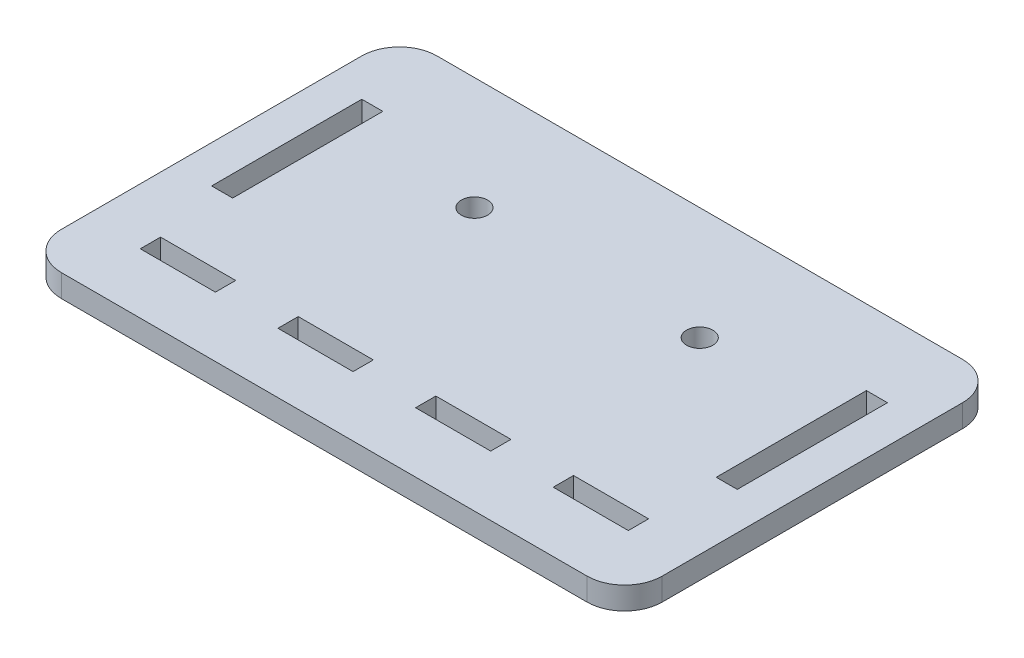
ISO-10303-21;
HEADER;
FILE_DESCRIPTION(('STEP AP214'),'2;1');
FILE_NAME('part.step','',(''),(''),'','','');
FILE_SCHEMA(('AUTOMOTIVE_DESIGN { 1 0 10303 214 1 1 1 1 }'));
ENDSEC;
DATA;
#1=APPLICATION_CONTEXT('core data for automotive mechanical design processes');
#2=APPLICATION_PROTOCOL_DEFINITION('international standard','automotive_design',2000,#1);
#3=PRODUCT_CONTEXT('',#1,'mechanical');
#4=PRODUCT('Part','Part','',(#3));
#5=PRODUCT_RELATED_PRODUCT_CATEGORY('part','',(#4));
#6=PRODUCT_DEFINITION_FORMATION('','',#4);
#7=PRODUCT_DEFINITION_CONTEXT('part definition',#1,'design');
#8=PRODUCT_DEFINITION('design','',#6,#7);
#9=PRODUCT_DEFINITION_SHAPE('','',#8);
#10=(LENGTH_UNIT() NAMED_UNIT(*) SI_UNIT(.MILLI.,.METRE.));
#11=(NAMED_UNIT(*) PLANE_ANGLE_UNIT() SI_UNIT($,.RADIAN.));
#12=(NAMED_UNIT(*) SI_UNIT($,.STERADIAN.) SOLID_ANGLE_UNIT());
#13=UNCERTAINTY_MEASURE_WITH_UNIT(LENGTH_MEASURE(1.E-05),#10,'distance_accuracy_value','');
#14=(GEOMETRIC_REPRESENTATION_CONTEXT(3) GLOBAL_UNCERTAINTY_ASSIGNED_CONTEXT((#13)) GLOBAL_UNIT_ASSIGNED_CONTEXT((#10,
#11,#12)) REPRESENTATION_CONTEXT('',''));
#15=CARTESIAN_POINT('',(0.,0.,0.));
#16=DIRECTION('',(0.,0.,1.));
#17=DIRECTION('',(1.,0.,0.));
#18=AXIS2_PLACEMENT_3D('',#15,#16,#17);
#19=CARTESIAN_POINT('',(0.,3.,0.));
#20=DIRECTION('',(0.,1.,0.));
#21=DIRECTION('',(0.,0.,1.));
#22=AXIS2_PLACEMENT_3D('',#19,#20,#21);
#23=PLANE('',#22);
#24=CARTESIAN_POINT('',(-15.,3.,-9.99999999999979));
#25=DIRECTION('',(0.,1.,0.));
#26=DIRECTION('',(0.,0.,1.));
#27=AXIS2_PLACEMENT_3D('',#24,#25,#26);
#28=CIRCLE('',#27,1.75);
#29=CARTESIAN_POINT('',(-15.,3.,-8.24999999999979));
#30=VERTEX_POINT('',#29);
#31=EDGE_CURVE('E928',#30,#30,#28,.T.);
#32=ORIENTED_EDGE('',*,*,#31,.F.);
#33=EDGE_LOOP('',(#32));
#34=FACE_BOUND('',#33,.T.);
#35=CARTESIAN_POINT('',(15.,3.,-10.));
#36=DIRECTION('',(0.,1.,0.));
#37=DIRECTION('',(0.,0.,1.));
#38=AXIS2_PLACEMENT_3D('',#35,#36,#37);
#39=CIRCLE('',#38,1.75);
#40=CARTESIAN_POINT('',(15.,3.,-8.25));
#41=VERTEX_POINT('',#40);
#42=EDGE_CURVE('E924',#41,#41,#39,.T.);
#43=ORIENTED_EDGE('',*,*,#42,.F.);
#44=EDGE_LOOP('',(#43));
#45=FACE_BOUND('',#44,.T.);
#46=DIRECTION('',(1.,0.,0.));
#47=VECTOR('',#46,1.);
#48=CARTESIAN_POINT('',(22.49,3.,17.));
#49=LINE('',#48,#47);
#50=CARTESIAN_POINT('',(22.49,3.,17.));
#51=VERTEX_POINT('',#50);
#52=CARTESIAN_POINT('',(32.49,3.,17.));
#53=VERTEX_POINT('',#52);
#54=EDGE_CURVE('E287',#51,#53,#49,.T.);
#55=ORIENTED_EDGE('',*,*,#54,.F.);
#56=DIRECTION('',(0.,0.,1.));
#57=VECTOR('',#56,1.);
#58=CARTESIAN_POINT('',(22.49,3.,17.));
#59=LINE('',#58,#57);
#60=CARTESIAN_POINT('',(22.49,3.,14.3));
#61=VERTEX_POINT('',#60);
#62=EDGE_CURVE('E285',#61,#51,#59,.T.);
#63=ORIENTED_EDGE('',*,*,#62,.F.);
#64=DIRECTION('',(-1.,0.,0.));
#65=VECTOR('',#64,1.);
#66=CARTESIAN_POINT('',(22.49,3.,14.3));
#67=LINE('',#66,#65);
#68=CARTESIAN_POINT('',(32.49,3.,14.3));
#69=VERTEX_POINT('',#68);
#70=EDGE_CURVE('E293',#69,#61,#67,.T.);
#71=ORIENTED_EDGE('',*,*,#70,.F.);
#72=DIRECTION('',(0.,0.,-1.));
#73=VECTOR('',#72,1.);
#74=CARTESIAN_POINT('',(32.49,3.,17.));
#75=LINE('',#74,#73);
#76=EDGE_CURVE('E290',#53,#69,#75,.T.);
#77=ORIENTED_EDGE('',*,*,#76,.F.);
#78=EDGE_LOOP('',(#55,#63,#71,#77));
#79=FACE_BOUND('',#78,.T.);
#80=DIRECTION('',(1.,0.,0.));
#81=VECTOR('',#80,1.);
#82=CARTESIAN_POINT('',(-14.17,3.,17.));
#83=LINE('',#82,#81);
#84=CARTESIAN_POINT('',(-14.17,3.,17.));
#85=VERTEX_POINT('',#84);
#86=CARTESIAN_POINT('',(-4.16999999999999,3.,17.));
#87=VERTEX_POINT('',#86);
#88=EDGE_CURVE('E349',#85,#87,#83,.T.);
#89=ORIENTED_EDGE('',*,*,#88,.F.);
#90=DIRECTION('',(0.,0.,1.));
#91=VECTOR('',#90,1.);
#92=CARTESIAN_POINT('',(-14.17,3.,17.));
#93=LINE('',#92,#91);
#94=CARTESIAN_POINT('',(-14.17,3.,14.3));
#95=VERTEX_POINT('',#94);
#96=EDGE_CURVE('E347',#95,#85,#93,.T.);
#97=ORIENTED_EDGE('',*,*,#96,.F.);
#98=DIRECTION('',(-1.,0.,0.));
#99=VECTOR('',#98,1.);
#100=CARTESIAN_POINT('',(-14.17,3.,14.3));
#101=LINE('',#100,#99);
#102=CARTESIAN_POINT('',(-4.16999999999999,3.,14.3));
#103=VERTEX_POINT('',#102);
#104=EDGE_CURVE('E355',#103,#95,#101,.T.);
#105=ORIENTED_EDGE('',*,*,#104,.F.);
#106=DIRECTION('',(0.,0.,-1.));
#107=VECTOR('',#106,1.);
#108=CARTESIAN_POINT('',(-4.16999999999999,3.,17.));
#109=LINE('',#108,#107);
#110=EDGE_CURVE('E352',#87,#103,#109,.T.);
#111=ORIENTED_EDGE('',*,*,#110,.F.);
#112=EDGE_LOOP('',(#89,#97,#105,#111));
#113=FACE_BOUND('',#112,.T.);
#114=DIRECTION('',(1.,0.,0.));
#115=VECTOR('',#114,1.);
#116=CARTESIAN_POINT('',(-32.5,3.,17.));
#117=LINE('',#116,#115);
#118=CARTESIAN_POINT('',(-32.5,3.,17.));
#119=VERTEX_POINT('',#118);
#120=CARTESIAN_POINT('',(-22.5,3.,17.));
#121=VERTEX_POINT('',#120);
#122=EDGE_CURVE('E411',#119,#121,#117,.T.);
#123=ORIENTED_EDGE('',*,*,#122,.F.);
#124=DIRECTION('',(0.,0.,1.));
#125=VECTOR('',#124,1.);
#126=CARTESIAN_POINT('',(-32.5,3.,17.));
#127=LINE('',#126,#125);
#128=CARTESIAN_POINT('',(-32.5,3.,14.3));
#129=VERTEX_POINT('',#128);
#130=EDGE_CURVE('E409',#129,#119,#127,.T.);
#131=ORIENTED_EDGE('',*,*,#130,.F.);
#132=DIRECTION('',(-1.,0.,0.));
#133=VECTOR('',#132,1.);
#134=CARTESIAN_POINT('',(-32.5,3.,14.3));
#135=LINE('',#134,#133);
#136=CARTESIAN_POINT('',(-22.5,3.,14.3));
#137=VERTEX_POINT('',#136);
#138=EDGE_CURVE('E417',#137,#129,#135,.T.);
#139=ORIENTED_EDGE('',*,*,#138,.F.);
#140=DIRECTION('',(0.,0.,-1.));
#141=VECTOR('',#140,1.);
#142=CARTESIAN_POINT('',(-22.5,3.,17.));
#143=LINE('',#142,#141);
#144=EDGE_CURVE('E414',#121,#137,#143,.T.);
#145=ORIENTED_EDGE('',*,*,#144,.F.);
#146=EDGE_LOOP('',(#123,#131,#139,#145));
#147=FACE_BOUND('',#146,.T.);
#148=DIRECTION('',(1.,0.,0.));
#149=VECTOR('',#148,1.);
#150=CARTESIAN_POINT('',(-40.,3.,25.));
#151=LINE('',#150,#149);
#152=CARTESIAN_POINT('',(-35.,3.,25.));
#153=VERTEX_POINT('',#152);
#154=CARTESIAN_POINT('',(35.,3.,25.));
#155=VERTEX_POINT('',#154);
#156=EDGE_CURVE('E443',#153,#155,#151,.T.);
#157=ORIENTED_EDGE('',*,*,#156,.T.);
#158=CARTESIAN_POINT('',(35.,3.,20.));
#159=DIRECTION('',(0.,1.,0.));
#160=DIRECTION('',(0.,0.,1.));
#161=AXIS2_PLACEMENT_3D('',#158,#159,#160);
#162=CIRCLE('',#161,5.);
#163=CARTESIAN_POINT('',(40.,3.,20.));
#164=VERTEX_POINT('',#163);
#165=EDGE_CURVE('E483',#155,#164,#162,.T.);
#166=ORIENTED_EDGE('',*,*,#165,.T.);
#167=DIRECTION('',(0.,0.,-1.));
#168=VECTOR('',#167,1.);
#169=CARTESIAN_POINT('',(40.,3.,-25.));
#170=LINE('',#169,#168);
#171=CARTESIAN_POINT('',(40.,3.,-20.));
#172=VERTEX_POINT('',#171);
#173=EDGE_CURVE('E447',#164,#172,#170,.T.);
#174=ORIENTED_EDGE('',*,*,#173,.T.);
#175=CARTESIAN_POINT('',(35.,3.,-20.));
#176=DIRECTION('',(0.,1.,0.));
#177=DIRECTION('',(0.,0.,1.));
#178=AXIS2_PLACEMENT_3D('',#175,#176,#177);
#179=CIRCLE('',#178,5.);
#180=CARTESIAN_POINT('',(35.,3.,-25.));
#181=VERTEX_POINT('',#180);
#182=EDGE_CURVE('E52',#172,#181,#179,.T.);
#183=ORIENTED_EDGE('',*,*,#182,.T.);
#184=DIRECTION('',(-1.,0.,0.));
#185=VECTOR('',#184,1.);
#186=CARTESIAN_POINT('',(40.,3.,-25.));
#187=LINE('',#186,#185);
#188=CARTESIAN_POINT('',(-35.,3.,-25.));
#189=VERTEX_POINT('',#188);
#190=EDGE_CURVE('E449',#181,#189,#187,.T.);
#191=ORIENTED_EDGE('',*,*,#190,.T.);
#192=CARTESIAN_POINT('',(-35.,3.,-20.));
#193=DIRECTION('',(0.,1.,0.));
#194=DIRECTION('',(0.,0.,1.));
#195=AXIS2_PLACEMENT_3D('',#192,#193,#194);
#196=CIRCLE('',#195,5.);
#197=CARTESIAN_POINT('',(-40.,3.,-20.));
#198=VERTEX_POINT('',#197);
#199=EDGE_CURVE('E479',#189,#198,#196,.T.);
#200=ORIENTED_EDGE('',*,*,#199,.T.);
#201=DIRECTION('',(0.,0.,1.));
#202=VECTOR('',#201,1.);
#203=CARTESIAN_POINT('',(-40.,3.,-25.));
#204=LINE('',#203,#202);
#205=CARTESIAN_POINT('',(-40.,3.,20.));
#206=VERTEX_POINT('',#205);
#207=EDGE_CURVE('E440',#198,#206,#204,.T.);
#208=ORIENTED_EDGE('',*,*,#207,.T.);
#209=CARTESIAN_POINT('',(-35.,3.,20.));
#210=DIRECTION('',(0.,1.,0.));
#211=DIRECTION('',(0.,0.,1.));
#212=AXIS2_PLACEMENT_3D('',#209,#210,#211);
#213=CIRCLE('',#212,5.);
#214=EDGE_CURVE('E481',#206,#153,#213,.T.);
#215=ORIENTED_EDGE('',*,*,#214,.T.);
#216=EDGE_LOOP('',(#157,#166,#174,#183,#191,#200,#208,#215));
#217=FACE_BOUND('',#216,.T.);
#218=DIRECTION('',(-1.,0.,0.));
#219=VECTOR('',#218,1.);
#220=CARTESIAN_POINT('',(35.,3.,-15.));
#221=LINE('',#220,#219);
#222=CARTESIAN_POINT('',(35.,3.,-15.));
#223=VERTEX_POINT('',#222);
#224=CARTESIAN_POINT('',(32.2,3.,-15.));
#225=VERTEX_POINT('',#224);
#226=EDGE_CURVE('E380',#223,#225,#221,.T.);
#227=ORIENTED_EDGE('',*,*,#226,.F.);
#228=DIRECTION('',(0.,0.,-1.));
#229=VECTOR('',#228,1.);
#230=CARTESIAN_POINT('',(35.,3.,-15.));
#231=LINE('',#230,#229);
#232=CARTESIAN_POINT('',(35.,3.,4.99999999999999));
#233=VERTEX_POINT('',#232);
#234=EDGE_CURVE('E378',#233,#223,#231,.T.);
#235=ORIENTED_EDGE('',*,*,#234,.F.);
#236=DIRECTION('',(1.,0.,0.));
#237=VECTOR('',#236,1.);
#238=CARTESIAN_POINT('',(35.,3.,4.99999999999999));
#239=LINE('',#238,#237);
#240=CARTESIAN_POINT('',(32.2,3.,4.99999999999999));
#241=VERTEX_POINT('',#240);
#242=EDGE_CURVE('E386',#241,#233,#239,.T.);
#243=ORIENTED_EDGE('',*,*,#242,.F.);
#244=DIRECTION('',(0.,0.,1.));
#245=VECTOR('',#244,1.);
#246=CARTESIAN_POINT('',(32.2,3.,-15.));
#247=LINE('',#246,#245);
#248=EDGE_CURVE('E383',#225,#241,#247,.T.);
#249=ORIENTED_EDGE('',*,*,#248,.F.);
#250=EDGE_LOOP('',(#227,#235,#243,#249));
#251=FACE_BOUND('',#250,.T.);
#252=DIRECTION('',(1.,0.,0.));
#253=VECTOR('',#252,1.);
#254=CARTESIAN_POINT('',(4.16,3.,17.));
#255=LINE('',#254,#253);
#256=CARTESIAN_POINT('',(4.16,3.,17.));
#257=VERTEX_POINT('',#256);
#258=CARTESIAN_POINT('',(14.16,3.,17.));
#259=VERTEX_POINT('',#258);
#260=EDGE_CURVE('E318',#257,#259,#255,.T.);
#261=ORIENTED_EDGE('',*,*,#260,.F.);
#262=DIRECTION('',(0.,0.,1.));
#263=VECTOR('',#262,1.);
#264=CARTESIAN_POINT('',(4.16,3.,17.));
#265=LINE('',#264,#263);
#266=CARTESIAN_POINT('',(4.16,3.,14.3));
#267=VERTEX_POINT('',#266);
#268=EDGE_CURVE('E316',#267,#257,#265,.T.);
#269=ORIENTED_EDGE('',*,*,#268,.F.);
#270=DIRECTION('',(-1.,0.,0.));
#271=VECTOR('',#270,1.);
#272=CARTESIAN_POINT('',(4.16,3.,14.3));
#273=LINE('',#272,#271);
#274=CARTESIAN_POINT('',(14.16,3.,14.3));
#275=VERTEX_POINT('',#274);
#276=EDGE_CURVE('E324',#275,#267,#273,.T.);
#277=ORIENTED_EDGE('',*,*,#276,.F.);
#278=DIRECTION('',(0.,0.,-1.));
#279=VECTOR('',#278,1.);
#280=CARTESIAN_POINT('',(14.16,3.,17.));
#281=LINE('',#280,#279);
#282=EDGE_CURVE('E321',#259,#275,#281,.T.);
#283=ORIENTED_EDGE('',*,*,#282,.F.);
#284=EDGE_LOOP('',(#261,#269,#277,#283));
#285=FACE_BOUND('',#284,.T.);
#286=DIRECTION('',(0.,0.,1.));
#287=VECTOR('',#286,1.);
#288=CARTESIAN_POINT('',(-35.,3.,-15.));
#289=LINE('',#288,#287);
#290=CARTESIAN_POINT('',(-35.,3.,-15.));
#291=VERTEX_POINT('',#290);
#292=CARTESIAN_POINT('',(-35.,3.,4.99999999999999));
#293=VERTEX_POINT('',#292);
#294=EDGE_CURVE('E252',#291,#293,#289,.T.);
#295=ORIENTED_EDGE('',*,*,#294,.F.);
#296=DIRECTION('',(-1.,0.,0.));
#297=VECTOR('',#296,1.);
#298=CARTESIAN_POINT('',(-35.,3.,-15.));
#299=LINE('',#298,#297);
#300=CARTESIAN_POINT('',(-32.2,3.,-15.));
#301=VERTEX_POINT('',#300);
#302=EDGE_CURVE('E242',#301,#291,#299,.T.);
#303=ORIENTED_EDGE('',*,*,#302,.F.);
#304=DIRECTION('',(0.,0.,-1.));
#305=VECTOR('',#304,1.);
#306=CARTESIAN_POINT('',(-32.2,3.,-15.));
#307=LINE('',#306,#305);
#308=CARTESIAN_POINT('',(-32.2,3.,4.99999999999999));
#309=VERTEX_POINT('',#308);
#310=EDGE_CURVE('E267',#309,#301,#307,.T.);
#311=ORIENTED_EDGE('',*,*,#310,.F.);
#312=DIRECTION('',(1.,0.,0.));
#313=VECTOR('',#312,1.);
#314=CARTESIAN_POINT('',(-35.,3.,4.99999999999999));
#315=LINE('',#314,#313);
#316=EDGE_CURVE('E265',#293,#309,#315,.T.);
#317=ORIENTED_EDGE('',*,*,#316,.F.);
#318=EDGE_LOOP('',(#295,#303,#311,#317));
#319=FACE_BOUND('',#318,.T.);
#320=ADVANCED_FACE('F32',(#34,#45,#79,#113,#147,#217,#251,#285,#319),#23,.T.);
#321=CARTESIAN_POINT('',(0.,0.,0.));
#322=DIRECTION('',(0.,1.,0.));
#323=DIRECTION('',(0.,0.,1.));
#324=AXIS2_PLACEMENT_3D('',#321,#322,#323);
#325=PLANE('',#324);
#326=CARTESIAN_POINT('',(-15.,0.,-9.99999999999979));
#327=DIRECTION('',(0.,1.,0.));
#328=DIRECTION('',(0.,0.,1.));
#329=AXIS2_PLACEMENT_3D('',#326,#327,#328);
#330=CIRCLE('',#329,1.75);
#331=CARTESIAN_POINT('',(-15.,0.,-8.24999999999979));
#332=VERTEX_POINT('',#331);
#333=EDGE_CURVE('E925',#332,#332,#330,.T.);
#334=ORIENTED_EDGE('',*,*,#333,.T.);
#335=EDGE_LOOP('',(#334));
#336=FACE_BOUND('',#335,.T.);
#337=CARTESIAN_POINT('',(15.,0.,-10.));
#338=DIRECTION('',(0.,1.,0.));
#339=DIRECTION('',(0.,0.,1.));
#340=AXIS2_PLACEMENT_3D('',#337,#338,#339);
#341=CIRCLE('',#340,1.75);
#342=CARTESIAN_POINT('',(15.,0.,-8.25));
#343=VERTEX_POINT('',#342);
#344=EDGE_CURVE('E274',#343,#343,#341,.T.);
#345=ORIENTED_EDGE('',*,*,#344,.T.);
#346=EDGE_LOOP('',(#345));
#347=FACE_BOUND('',#346,.T.);
#348=DIRECTION('',(0.,0.,1.));
#349=VECTOR('',#348,1.);
#350=CARTESIAN_POINT('',(22.49,0.,17.));
#351=LINE('',#350,#349);
#352=CARTESIAN_POINT('',(22.49,0.,14.3));
#353=VERTEX_POINT('',#352);
#354=CARTESIAN_POINT('',(22.49,0.,17.));
#355=VERTEX_POINT('',#354);
#356=EDGE_CURVE('E260',#353,#355,#351,.T.);
#357=ORIENTED_EDGE('',*,*,#356,.T.);
#358=DIRECTION('',(1.,0.,0.));
#359=VECTOR('',#358,1.);
#360=CARTESIAN_POINT('',(22.49,0.,17.));
#361=LINE('',#360,#359);
#362=CARTESIAN_POINT('',(32.49,0.,17.));
#363=VERTEX_POINT('',#362);
#364=EDGE_CURVE('E298',#355,#363,#361,.T.);
#365=ORIENTED_EDGE('',*,*,#364,.T.);
#366=DIRECTION('',(0.,0.,-1.));
#367=VECTOR('',#366,1.);
#368=CARTESIAN_POINT('',(32.49,0.,17.));
#369=LINE('',#368,#367);
#370=CARTESIAN_POINT('',(32.49,0.,14.3));
#371=VERTEX_POINT('',#370);
#372=EDGE_CURVE('E301',#363,#371,#369,.T.);
#373=ORIENTED_EDGE('',*,*,#372,.T.);
#374=DIRECTION('',(-1.,0.,0.));
#375=VECTOR('',#374,1.);
#376=CARTESIAN_POINT('',(22.49,0.,14.3));
#377=LINE('',#376,#375);
#378=EDGE_CURVE('E288',#371,#353,#377,.T.);
#379=ORIENTED_EDGE('',*,*,#378,.T.);
#380=EDGE_LOOP('',(#357,#365,#373,#379));
#381=FACE_BOUND('',#380,.T.);
#382=DIRECTION('',(0.,0.,1.));
#383=VECTOR('',#382,1.);
#384=CARTESIAN_POINT('',(-14.17,0.,17.));
#385=LINE('',#384,#383);
#386=CARTESIAN_POINT('',(-14.17,0.,14.3));
#387=VERTEX_POINT('',#386);
#388=CARTESIAN_POINT('',(-14.17,0.,17.));
#389=VERTEX_POINT('',#388);
#390=EDGE_CURVE('E346',#387,#389,#385,.T.);
#391=ORIENTED_EDGE('',*,*,#390,.T.);
#392=DIRECTION('',(1.,0.,0.));
#393=VECTOR('',#392,1.);
#394=CARTESIAN_POINT('',(-14.17,0.,17.));
#395=LINE('',#394,#393);
#396=CARTESIAN_POINT('',(-4.16999999999999,0.,17.));
#397=VERTEX_POINT('',#396);
#398=EDGE_CURVE('E360',#389,#397,#395,.T.);
#399=ORIENTED_EDGE('',*,*,#398,.T.);
#400=DIRECTION('',(0.,0.,-1.));
#401=VECTOR('',#400,1.);
#402=CARTESIAN_POINT('',(-4.16999999999999,0.,17.));
#403=LINE('',#402,#401);
#404=CARTESIAN_POINT('',(-4.16999999999999,0.,14.3));
#405=VERTEX_POINT('',#404);
#406=EDGE_CURVE('E363',#397,#405,#403,.T.);
#407=ORIENTED_EDGE('',*,*,#406,.T.);
#408=DIRECTION('',(-1.,0.,0.));
#409=VECTOR('',#408,1.);
#410=CARTESIAN_POINT('',(-14.17,0.,14.3));
#411=LINE('',#410,#409);
#412=EDGE_CURVE('E350',#405,#387,#411,.T.);
#413=ORIENTED_EDGE('',*,*,#412,.T.);
#414=EDGE_LOOP('',(#391,#399,#407,#413));
#415=FACE_BOUND('',#414,.T.);
#416=DIRECTION('',(0.,0.,1.));
#417=VECTOR('',#416,1.);
#418=CARTESIAN_POINT('',(-32.5,0.,17.));
#419=LINE('',#418,#417);
#420=CARTESIAN_POINT('',(-32.5,0.,14.3));
#421=VERTEX_POINT('',#420);
#422=CARTESIAN_POINT('',(-32.5,0.,17.));
#423=VERTEX_POINT('',#422);
#424=EDGE_CURVE('E408',#421,#423,#419,.T.);
#425=ORIENTED_EDGE('',*,*,#424,.T.);
#426=DIRECTION('',(1.,0.,0.));
#427=VECTOR('',#426,1.);
#428=CARTESIAN_POINT('',(-32.5,0.,17.));
#429=LINE('',#428,#427);
#430=CARTESIAN_POINT('',(-22.5,0.,17.));
#431=VERTEX_POINT('',#430);
#432=EDGE_CURVE('E422',#423,#431,#429,.T.);
#433=ORIENTED_EDGE('',*,*,#432,.T.);
#434=DIRECTION('',(0.,0.,-1.));
#435=VECTOR('',#434,1.);
#436=CARTESIAN_POINT('',(-22.5,0.,17.));
#437=LINE('',#436,#435);
#438=CARTESIAN_POINT('',(-22.5,0.,14.3));
#439=VERTEX_POINT('',#438);
#440=EDGE_CURVE('E425',#431,#439,#437,.T.);
#441=ORIENTED_EDGE('',*,*,#440,.T.);
#442=DIRECTION('',(-1.,0.,0.));
#443=VECTOR('',#442,1.);
#444=CARTESIAN_POINT('',(-32.5,0.,14.3));
#445=LINE('',#444,#443);
#446=EDGE_CURVE('E412',#439,#421,#445,.T.);
#447=ORIENTED_EDGE('',*,*,#446,.T.);
#448=EDGE_LOOP('',(#425,#433,#441,#447));
#449=FACE_BOUND('',#448,.T.);
#450=DIRECTION('',(0.,0.,-1.));
#451=VECTOR('',#450,1.);
#452=CARTESIAN_POINT('',(40.,0.,-25.));
#453=LINE('',#452,#451);
#454=CARTESIAN_POINT('',(40.,0.,20.));
#455=VERTEX_POINT('',#454);
#456=CARTESIAN_POINT('',(40.,0.,-20.));
#457=VERTEX_POINT('',#456);
#458=EDGE_CURVE('E457',#455,#457,#453,.T.);
#459=ORIENTED_EDGE('',*,*,#458,.F.);
#460=CARTESIAN_POINT('',(35.,0.,20.));
#461=DIRECTION('',(0.,1.,0.));
#462=DIRECTION('',(0.,0.,1.));
#463=AXIS2_PLACEMENT_3D('',#460,#461,#462);
#464=CIRCLE('',#463,5.);
#465=CARTESIAN_POINT('',(35.,0.,25.));
#466=VERTEX_POINT('',#465);
#467=EDGE_CURVE('E471',#455,#466,#464,.F.);
#468=ORIENTED_EDGE('',*,*,#467,.T.);
#469=DIRECTION('',(1.,0.,0.));
#470=VECTOR('',#469,1.);
#471=CARTESIAN_POINT('',(-40.,0.,25.));
#472=LINE('',#471,#470);
#473=CARTESIAN_POINT('',(-35.,0.,25.));
#474=VERTEX_POINT('',#473);
#475=EDGE_CURVE('E454',#474,#466,#472,.T.);
#476=ORIENTED_EDGE('',*,*,#475,.F.);
#477=CARTESIAN_POINT('',(-35.,0.,20.));
#478=DIRECTION('',(0.,1.,0.));
#479=DIRECTION('',(0.,0.,1.));
#480=AXIS2_PLACEMENT_3D('',#477,#478,#479);
#481=CIRCLE('',#480,5.);
#482=CARTESIAN_POINT('',(-40.,0.,20.));
#483=VERTEX_POINT('',#482);
#484=EDGE_CURVE('E469',#474,#483,#481,.F.);
#485=ORIENTED_EDGE('',*,*,#484,.T.);
#486=DIRECTION('',(0.,0.,1.));
#487=VECTOR('',#486,1.);
#488=CARTESIAN_POINT('',(-40.,0.,-25.));
#489=LINE('',#488,#487);
#490=CARTESIAN_POINT('',(-40.,0.,-20.));
#491=VERTEX_POINT('',#490);
#492=EDGE_CURVE('E439',#491,#483,#489,.T.);
#493=ORIENTED_EDGE('',*,*,#492,.F.);
#494=CARTESIAN_POINT('',(-35.,0.,-20.));
#495=DIRECTION('',(0.,1.,0.));
#496=DIRECTION('',(0.,0.,1.));
#497=AXIS2_PLACEMENT_3D('',#494,#495,#496);
#498=CIRCLE('',#497,5.);
#499=CARTESIAN_POINT('',(-35.,0.,-25.));
#500=VERTEX_POINT('',#499);
#501=EDGE_CURVE('E467',#491,#500,#498,.F.);
#502=ORIENTED_EDGE('',*,*,#501,.T.);
#503=DIRECTION('',(-1.,0.,0.));
#504=VECTOR('',#503,1.);
#505=CARTESIAN_POINT('',(40.,0.,-25.));
#506=LINE('',#505,#504);
#507=CARTESIAN_POINT('',(35.,0.,-25.));
#508=VERTEX_POINT('',#507);
#509=EDGE_CURVE('E444',#508,#500,#506,.T.);
#510=ORIENTED_EDGE('',*,*,#509,.F.);
#511=CARTESIAN_POINT('',(35.,0.,-20.));
#512=DIRECTION('',(0.,1.,0.));
#513=DIRECTION('',(0.,0.,1.));
#514=AXIS2_PLACEMENT_3D('',#511,#512,#513);
#515=CIRCLE('',#514,5.);
#516=EDGE_CURVE('E465',#508,#457,#515,.F.);
#517=ORIENTED_EDGE('',*,*,#516,.T.);
#518=EDGE_LOOP('',(#459,#468,#476,#485,#493,#502,#510,#517));
#519=FACE_BOUND('',#518,.T.);
#520=DIRECTION('',(0.,0.,-1.));
#521=VECTOR('',#520,1.);
#522=CARTESIAN_POINT('',(35.,0.,-15.));
#523=LINE('',#522,#521);
#524=CARTESIAN_POINT('',(35.,0.,4.99999999999999));
#525=VERTEX_POINT('',#524);
#526=CARTESIAN_POINT('',(35.,0.,-15.));
#527=VERTEX_POINT('',#526);
#528=EDGE_CURVE('E377',#525,#527,#523,.T.);
#529=ORIENTED_EDGE('',*,*,#528,.T.);
#530=DIRECTION('',(-1.,0.,0.));
#531=VECTOR('',#530,1.);
#532=CARTESIAN_POINT('',(35.,0.,-15.));
#533=LINE('',#532,#531);
#534=CARTESIAN_POINT('',(32.2,0.,-15.));
#535=VERTEX_POINT('',#534);
#536=EDGE_CURVE('E391',#527,#535,#533,.T.);
#537=ORIENTED_EDGE('',*,*,#536,.T.);
#538=DIRECTION('',(0.,0.,1.));
#539=VECTOR('',#538,1.);
#540=CARTESIAN_POINT('',(32.2,0.,-15.));
#541=LINE('',#540,#539);
#542=CARTESIAN_POINT('',(32.2,0.,4.99999999999999));
#543=VERTEX_POINT('',#542);
#544=EDGE_CURVE('E394',#535,#543,#541,.T.);
#545=ORIENTED_EDGE('',*,*,#544,.T.);
#546=DIRECTION('',(1.,0.,0.));
#547=VECTOR('',#546,1.);
#548=CARTESIAN_POINT('',(35.,0.,4.99999999999999));
#549=LINE('',#548,#547);
#550=EDGE_CURVE('E381',#543,#525,#549,.T.);
#551=ORIENTED_EDGE('',*,*,#550,.T.);
#552=EDGE_LOOP('',(#529,#537,#545,#551));
#553=FACE_BOUND('',#552,.T.);
#554=DIRECTION('',(0.,0.,1.));
#555=VECTOR('',#554,1.);
#556=CARTESIAN_POINT('',(4.16,0.,17.));
#557=LINE('',#556,#555);
#558=CARTESIAN_POINT('',(4.16,0.,14.3));
#559=VERTEX_POINT('',#558);
#560=CARTESIAN_POINT('',(4.16,0.,17.));
#561=VERTEX_POINT('',#560);
#562=EDGE_CURVE('E315',#559,#561,#557,.T.);
#563=ORIENTED_EDGE('',*,*,#562,.T.);
#564=DIRECTION('',(1.,0.,0.));
#565=VECTOR('',#564,1.);
#566=CARTESIAN_POINT('',(4.16,0.,17.));
#567=LINE('',#566,#565);
#568=CARTESIAN_POINT('',(14.16,0.,17.));
#569=VERTEX_POINT('',#568);
#570=EDGE_CURVE('E329',#561,#569,#567,.T.);
#571=ORIENTED_EDGE('',*,*,#570,.T.);
#572=DIRECTION('',(0.,0.,-1.));
#573=VECTOR('',#572,1.);
#574=CARTESIAN_POINT('',(14.16,0.,17.));
#575=LINE('',#574,#573);
#576=CARTESIAN_POINT('',(14.16,0.,14.3));
#577=VERTEX_POINT('',#576);
#578=EDGE_CURVE('E332',#569,#577,#575,.T.);
#579=ORIENTED_EDGE('',*,*,#578,.T.);
#580=DIRECTION('',(-1.,0.,0.));
#581=VECTOR('',#580,1.);
#582=CARTESIAN_POINT('',(4.16,0.,14.3));
#583=LINE('',#582,#581);
#584=EDGE_CURVE('E319',#577,#559,#583,.T.);
#585=ORIENTED_EDGE('',*,*,#584,.T.);
#586=EDGE_LOOP('',(#563,#571,#579,#585));
#587=FACE_BOUND('',#586,.T.);
#588=DIRECTION('',(-1.,0.,0.));
#589=VECTOR('',#588,1.);
#590=CARTESIAN_POINT('',(-35.,0.,-15.));
#591=LINE('',#590,#589);
#592=CARTESIAN_POINT('',(-32.2,0.,-15.));
#593=VERTEX_POINT('',#592);
#594=CARTESIAN_POINT('',(-35.,0.,-15.));
#595=VERTEX_POINT('',#594);
#596=EDGE_CURVE('E272',#593,#595,#591,.T.);
#597=ORIENTED_EDGE('',*,*,#596,.T.);
#598=DIRECTION('',(0.,0.,1.));
#599=VECTOR('',#598,1.);
#600=CARTESIAN_POINT('',(-35.,0.,-15.));
#601=LINE('',#600,#599);
#602=CARTESIAN_POINT('',(-35.,0.,4.99999999999999));
#603=VERTEX_POINT('',#602);
#604=EDGE_CURVE('E259',#595,#603,#601,.T.);
#605=ORIENTED_EDGE('',*,*,#604,.T.);
#606=DIRECTION('',(1.,0.,0.));
#607=VECTOR('',#606,1.);
#608=CARTESIAN_POINT('',(-35.,0.,4.99999999999999));
#609=LINE('',#608,#607);
#610=CARTESIAN_POINT('',(-32.2,0.,4.99999999999999));
#611=VERTEX_POINT('',#610);
#612=EDGE_CURVE('E276',#603,#611,#609,.T.);
#613=ORIENTED_EDGE('',*,*,#612,.T.);
#614=DIRECTION('',(0.,0.,-1.));
#615=VECTOR('',#614,1.);
#616=CARTESIAN_POINT('',(-32.2,0.,-15.));
#617=LINE('',#616,#615);
#618=EDGE_CURVE('E253',#611,#593,#617,.T.);
#619=ORIENTED_EDGE('',*,*,#618,.T.);
#620=EDGE_LOOP('',(#597,#605,#613,#619));
#621=FACE_BOUND('',#620,.T.);
#622=ADVANCED_FACE('F496',(#336,#347,#381,#415,#449,#519,#553,#587,#621),#325,.F.);
#623=CARTESIAN_POINT('',(-40.,3.,-25.));
#624=DIRECTION('',(1.,0.,0.));
#625=DIRECTION('',(0.,0.,-1.));
#626=AXIS2_PLACEMENT_3D('',#623,#624,#625);
#627=PLANE('',#626);
#628=ORIENTED_EDGE('',*,*,#492,.T.);
#629=DIRECTION('',(0.,-1.,0.));
#630=VECTOR('',#629,1.);
#631=CARTESIAN_POINT('',(-40.,3.,20.));
#632=LINE('',#631,#630);
#633=EDGE_CURVE('E488',#483,#206,#632,.F.);
#634=ORIENTED_EDGE('',*,*,#633,.T.);
#635=ORIENTED_EDGE('',*,*,#207,.F.);
#636=DIRECTION('',(0.,-1.,0.));
#637=VECTOR('',#636,1.);
#638=CARTESIAN_POINT('',(-40.,3.,-20.));
#639=LINE('',#638,#637);
#640=EDGE_CURVE('E485',#198,#491,#639,.T.);
#641=ORIENTED_EDGE('',*,*,#640,.T.);
#642=EDGE_LOOP('',(#628,#634,#635,#641));
#643=FACE_BOUND('',#642,.T.);
#644=ADVANCED_FACE('F505',(#643),#627,.F.);
#645=CARTESIAN_POINT('',(-40.,3.,25.));
#646=DIRECTION('',(0.,0.,-1.));
#647=DIRECTION('',(-1.,0.,0.));
#648=AXIS2_PLACEMENT_3D('',#645,#646,#647);
#649=PLANE('',#648);
#650=ORIENTED_EDGE('',*,*,#475,.T.);
#651=DIRECTION('',(0.,-1.,0.));
#652=VECTOR('',#651,1.);
#653=CARTESIAN_POINT('',(35.,3.,25.));
#654=LINE('',#653,#652);
#655=EDGE_CURVE('E476',#466,#155,#654,.F.);
#656=ORIENTED_EDGE('',*,*,#655,.T.);
#657=ORIENTED_EDGE('',*,*,#156,.F.);
#658=DIRECTION('',(0.,-1.,0.));
#659=VECTOR('',#658,1.);
#660=CARTESIAN_POINT('',(-35.,3.,25.));
#661=LINE('',#660,#659);
#662=EDGE_CURVE('E473',#153,#474,#661,.T.);
#663=ORIENTED_EDGE('',*,*,#662,.T.);
#664=EDGE_LOOP('',(#650,#656,#657,#663));
#665=FACE_BOUND('',#664,.T.);
#666=ADVANCED_FACE('F515',(#665),#649,.F.);
#667=CARTESIAN_POINT('',(40.,3.,-25.));
#668=DIRECTION('',(-1.,0.,0.));
#669=DIRECTION('',(0.,0.,1.));
#670=AXIS2_PLACEMENT_3D('',#667,#668,#669);
#671=PLANE('',#670);
#672=ORIENTED_EDGE('',*,*,#173,.F.);
#673=DIRECTION('',(0.,-1.,0.));
#674=VECTOR('',#673,1.);
#675=CARTESIAN_POINT('',(40.,3.,20.));
#676=LINE('',#675,#674);
#677=EDGE_CURVE('E462',#164,#455,#676,.T.);
#678=ORIENTED_EDGE('',*,*,#677,.T.);
#679=ORIENTED_EDGE('',*,*,#458,.T.);
#680=DIRECTION('',(0.,-1.,0.));
#681=VECTOR('',#680,1.);
#682=CARTESIAN_POINT('',(40.,3.,-20.));
#683=LINE('',#682,#681);
#684=EDGE_CURVE('E451',#457,#172,#683,.F.);
#685=ORIENTED_EDGE('',*,*,#684,.T.);
#686=EDGE_LOOP('',(#672,#678,#679,#685));
#687=FACE_BOUND('',#686,.T.);
#688=ADVANCED_FACE('F523',(#687),#671,.F.);
#689=CARTESIAN_POINT('',(40.,3.,-25.));
#690=DIRECTION('',(0.,0.,1.));
#691=DIRECTION('',(1.,0.,0.));
#692=AXIS2_PLACEMENT_3D('',#689,#690,#691);
#693=PLANE('',#692);
#694=ORIENTED_EDGE('',*,*,#509,.T.);
#695=DIRECTION('',(0.,-1.,0.));
#696=VECTOR('',#695,1.);
#697=CARTESIAN_POINT('',(-35.,3.,-25.));
#698=LINE('',#697,#696);
#699=EDGE_CURVE('E11',#500,#189,#698,.F.);
#700=ORIENTED_EDGE('',*,*,#699,.T.);
#701=ORIENTED_EDGE('',*,*,#190,.F.);
#702=DIRECTION('',(0.,-1.,0.));
#703=VECTOR('',#702,1.);
#704=CARTESIAN_POINT('',(35.,3.,-25.));
#705=LINE('',#704,#703);
#706=EDGE_CURVE('E40',#181,#508,#705,.T.);
#707=ORIENTED_EDGE('',*,*,#706,.T.);
#708=EDGE_LOOP('',(#694,#700,#701,#707));
#709=FACE_BOUND('',#708,.T.);
#710=ADVANCED_FACE('F492',(#709),#693,.F.);
#711=CARTESIAN_POINT('',(-32.5,3.,17.));
#712=DIRECTION('',(1.,0.,0.));
#713=DIRECTION('',(0.,0.,-1.));
#714=AXIS2_PLACEMENT_3D('',#711,#712,#713);
#715=PLANE('',#714);
#716=ORIENTED_EDGE('',*,*,#424,.F.);
#717=DIRECTION('',(0.,-1.,0.));
#718=VECTOR('',#717,1.);
#719=CARTESIAN_POINT('',(-32.5,3.,14.3));
#720=LINE('',#719,#718);
#721=EDGE_CURVE('E419',#129,#421,#720,.T.);
#722=ORIENTED_EDGE('',*,*,#721,.F.);
#723=ORIENTED_EDGE('',*,*,#130,.T.);
#724=DIRECTION('',(0.,-1.,0.));
#725=VECTOR('',#724,1.);
#726=CARTESIAN_POINT('',(-32.5,3.,17.));
#727=LINE('',#726,#725);
#728=EDGE_CURVE('E436',#119,#423,#727,.T.);
#729=ORIENTED_EDGE('',*,*,#728,.T.);
#730=EDGE_LOOP('',(#716,#722,#723,#729));
#731=FACE_BOUND('',#730,.T.);
#732=ADVANCED_FACE('F541',(#731),#715,.T.);
#733=CARTESIAN_POINT('',(-32.5,3.,17.));
#734=DIRECTION('',(0.,0.,-1.));
#735=DIRECTION('',(-1.,0.,0.));
#736=AXIS2_PLACEMENT_3D('',#733,#734,#735);
#737=PLANE('',#736);
#738=ORIENTED_EDGE('',*,*,#432,.F.);
#739=ORIENTED_EDGE('',*,*,#728,.F.);
#740=ORIENTED_EDGE('',*,*,#122,.T.);
#741=DIRECTION('',(0.,-1.,0.));
#742=VECTOR('',#741,1.);
#743=CARTESIAN_POINT('',(-22.5,3.,17.));
#744=LINE('',#743,#742);
#745=EDGE_CURVE('E434',#121,#431,#744,.T.);
#746=ORIENTED_EDGE('',*,*,#745,.T.);
#747=EDGE_LOOP('',(#738,#739,#740,#746));
#748=FACE_BOUND('',#747,.T.);
#749=ADVANCED_FACE('F786',(#748),#737,.T.);
#750=CARTESIAN_POINT('',(-22.5,3.,17.));
#751=DIRECTION('',(-1.,0.,0.));
#752=DIRECTION('',(0.,0.,1.));
#753=AXIS2_PLACEMENT_3D('',#750,#751,#752);
#754=PLANE('',#753);
#755=ORIENTED_EDGE('',*,*,#440,.F.);
#756=ORIENTED_EDGE('',*,*,#745,.F.);
#757=ORIENTED_EDGE('',*,*,#144,.T.);
#758=DIRECTION('',(0.,-1.,0.));
#759=VECTOR('',#758,1.);
#760=CARTESIAN_POINT('',(-22.5,3.,14.3));
#761=LINE('',#760,#759);
#762=EDGE_CURVE('E432',#137,#439,#761,.T.);
#763=ORIENTED_EDGE('',*,*,#762,.T.);
#764=EDGE_LOOP('',(#755,#756,#757,#763));
#765=FACE_BOUND('',#764,.T.);
#766=ADVANCED_FACE('F777',(#765),#754,.T.);
#767=CARTESIAN_POINT('',(-32.5,3.,14.3));
#768=DIRECTION('',(0.,0.,1.));
#769=DIRECTION('',(1.,0.,0.));
#770=AXIS2_PLACEMENT_3D('',#767,#768,#769);
#771=PLANE('',#770);
#772=ORIENTED_EDGE('',*,*,#446,.F.);
#773=ORIENTED_EDGE('',*,*,#762,.F.);
#774=ORIENTED_EDGE('',*,*,#138,.T.);
#775=ORIENTED_EDGE('',*,*,#721,.T.);
#776=EDGE_LOOP('',(#772,#773,#774,#775));
#777=FACE_BOUND('',#776,.T.);
#778=ADVANCED_FACE('F768',(#777),#771,.T.);
#779=CARTESIAN_POINT('',(35.,3.,-15.));
#780=DIRECTION('',(-1.,0.,0.));
#781=DIRECTION('',(0.,0.,1.));
#782=AXIS2_PLACEMENT_3D('',#779,#780,#781);
#783=PLANE('',#782);
#784=ORIENTED_EDGE('',*,*,#528,.F.);
#785=DIRECTION('',(0.,-1.,0.));
#786=VECTOR('',#785,1.);
#787=CARTESIAN_POINT('',(35.,3.,4.99999999999999));
#788=LINE('',#787,#786);
#789=EDGE_CURVE('E388',#233,#525,#788,.T.);
#790=ORIENTED_EDGE('',*,*,#789,.F.);
#791=ORIENTED_EDGE('',*,*,#234,.T.);
#792=DIRECTION('',(0.,-1.,0.));
#793=VECTOR('',#792,1.);
#794=CARTESIAN_POINT('',(35.,3.,-15.));
#795=LINE('',#794,#793);
#796=EDGE_CURVE('E405',#223,#527,#795,.T.);
#797=ORIENTED_EDGE('',*,*,#796,.T.);
#798=EDGE_LOOP('',(#784,#790,#791,#797));
#799=FACE_BOUND('',#798,.T.);
#800=ADVANCED_FACE('F759',(#799),#783,.T.);
#801=CARTESIAN_POINT('',(35.,3.,-15.));
#802=DIRECTION('',(0.,0.,1.));
#803=DIRECTION('',(1.,0.,0.));
#804=AXIS2_PLACEMENT_3D('',#801,#802,#803);
#805=PLANE('',#804);
#806=ORIENTED_EDGE('',*,*,#536,.F.);
#807=ORIENTED_EDGE('',*,*,#796,.F.);
#808=ORIENTED_EDGE('',*,*,#226,.T.);
#809=DIRECTION('',(0.,-1.,0.));
#810=VECTOR('',#809,1.);
#811=CARTESIAN_POINT('',(32.2,3.,-15.));
#812=LINE('',#811,#810);
#813=EDGE_CURVE('E403',#225,#535,#812,.T.);
#814=ORIENTED_EDGE('',*,*,#813,.T.);
#815=EDGE_LOOP('',(#806,#807,#808,#814));
#816=FACE_BOUND('',#815,.T.);
#817=ADVANCED_FACE('F750',(#816),#805,.T.);
#818=CARTESIAN_POINT('',(32.2,3.,-15.));
#819=DIRECTION('',(1.,0.,0.));
#820=DIRECTION('',(0.,0.,-1.));
#821=AXIS2_PLACEMENT_3D('',#818,#819,#820);
#822=PLANE('',#821);
#823=ORIENTED_EDGE('',*,*,#544,.F.);
#824=ORIENTED_EDGE('',*,*,#813,.F.);
#825=ORIENTED_EDGE('',*,*,#248,.T.);
#826=DIRECTION('',(0.,-1.,0.));
#827=VECTOR('',#826,1.);
#828=CARTESIAN_POINT('',(32.2,3.,4.99999999999999));
#829=LINE('',#828,#827);
#830=EDGE_CURVE('E401',#241,#543,#829,.T.);
#831=ORIENTED_EDGE('',*,*,#830,.T.);
#832=EDGE_LOOP('',(#823,#824,#825,#831));
#833=FACE_BOUND('',#832,.T.);
#834=ADVANCED_FACE('F741',(#833),#822,.T.);
#835=CARTESIAN_POINT('',(35.,3.,4.99999999999999));
#836=DIRECTION('',(0.,0.,-1.));
#837=DIRECTION('',(-1.,0.,0.));
#838=AXIS2_PLACEMENT_3D('',#835,#836,#837);
#839=PLANE('',#838);
#840=ORIENTED_EDGE('',*,*,#550,.F.);
#841=ORIENTED_EDGE('',*,*,#830,.F.);
#842=ORIENTED_EDGE('',*,*,#242,.T.);
#843=ORIENTED_EDGE('',*,*,#789,.T.);
#844=EDGE_LOOP('',(#840,#841,#842,#843));
#845=FACE_BOUND('',#844,.T.);
#846=ADVANCED_FACE('F732',(#845),#839,.T.);
#847=CARTESIAN_POINT('',(-14.17,3.,17.));
#848=DIRECTION('',(1.,0.,0.));
#849=DIRECTION('',(0.,0.,-1.));
#850=AXIS2_PLACEMENT_3D('',#847,#848,#849);
#851=PLANE('',#850);
#852=ORIENTED_EDGE('',*,*,#390,.F.);
#853=DIRECTION('',(0.,-1.,0.));
#854=VECTOR('',#853,1.);
#855=CARTESIAN_POINT('',(-14.17,3.,14.3));
#856=LINE('',#855,#854);
#857=EDGE_CURVE('E357',#95,#387,#856,.T.);
#858=ORIENTED_EDGE('',*,*,#857,.F.);
#859=ORIENTED_EDGE('',*,*,#96,.T.);
#860=DIRECTION('',(0.,-1.,0.));
#861=VECTOR('',#860,1.);
#862=CARTESIAN_POINT('',(-14.17,3.,17.));
#863=LINE('',#862,#861);
#864=EDGE_CURVE('E374',#85,#389,#863,.T.);
#865=ORIENTED_EDGE('',*,*,#864,.T.);
#866=EDGE_LOOP('',(#852,#858,#859,#865));
#867=FACE_BOUND('',#866,.T.);
#868=ADVANCED_FACE('F723',(#867),#851,.T.);
#869=CARTESIAN_POINT('',(-14.17,3.,17.));
#870=DIRECTION('',(0.,0.,-1.));
#871=DIRECTION('',(-1.,0.,0.));
#872=AXIS2_PLACEMENT_3D('',#869,#870,#871);
#873=PLANE('',#872);
#874=ORIENTED_EDGE('',*,*,#398,.F.);
#875=ORIENTED_EDGE('',*,*,#864,.F.);
#876=ORIENTED_EDGE('',*,*,#88,.T.);
#877=DIRECTION('',(0.,-1.,0.));
#878=VECTOR('',#877,1.);
#879=CARTESIAN_POINT('',(-4.16999999999999,3.,17.));
#880=LINE('',#879,#878);
#881=EDGE_CURVE('E372',#87,#397,#880,.T.);
#882=ORIENTED_EDGE('',*,*,#881,.T.);
#883=EDGE_LOOP('',(#874,#875,#876,#882));
#884=FACE_BOUND('',#883,.T.);
#885=ADVANCED_FACE('F714',(#884),#873,.T.);
#886=CARTESIAN_POINT('',(-4.16999999999999,3.,17.));
#887=DIRECTION('',(-1.,0.,0.));
#888=DIRECTION('',(0.,0.,1.));
#889=AXIS2_PLACEMENT_3D('',#886,#887,#888);
#890=PLANE('',#889);
#891=ORIENTED_EDGE('',*,*,#406,.F.);
#892=ORIENTED_EDGE('',*,*,#881,.F.);
#893=ORIENTED_EDGE('',*,*,#110,.T.);
#894=DIRECTION('',(0.,-1.,0.));
#895=VECTOR('',#894,1.);
#896=CARTESIAN_POINT('',(-4.16999999999999,3.,14.3));
#897=LINE('',#896,#895);
#898=EDGE_CURVE('E370',#103,#405,#897,.T.);
#899=ORIENTED_EDGE('',*,*,#898,.T.);
#900=EDGE_LOOP('',(#891,#892,#893,#899));
#901=FACE_BOUND('',#900,.T.);
#902=ADVANCED_FACE('F705',(#901),#890,.T.);
#903=CARTESIAN_POINT('',(-14.17,3.,14.3));
#904=DIRECTION('',(0.,0.,1.));
#905=DIRECTION('',(1.,0.,0.));
#906=AXIS2_PLACEMENT_3D('',#903,#904,#905);
#907=PLANE('',#906);
#908=ORIENTED_EDGE('',*,*,#412,.F.);
#909=ORIENTED_EDGE('',*,*,#898,.F.);
#910=ORIENTED_EDGE('',*,*,#104,.T.);
#911=ORIENTED_EDGE('',*,*,#857,.T.);
#912=EDGE_LOOP('',(#908,#909,#910,#911));
#913=FACE_BOUND('',#912,.T.);
#914=ADVANCED_FACE('F696',(#913),#907,.T.);
#915=CARTESIAN_POINT('',(4.16,3.,17.));
#916=DIRECTION('',(1.,0.,0.));
#917=DIRECTION('',(0.,0.,-1.));
#918=AXIS2_PLACEMENT_3D('',#915,#916,#917);
#919=PLANE('',#918);
#920=ORIENTED_EDGE('',*,*,#562,.F.);
#921=DIRECTION('',(0.,-1.,0.));
#922=VECTOR('',#921,1.);
#923=CARTESIAN_POINT('',(4.16,3.,14.3));
#924=LINE('',#923,#922);
#925=EDGE_CURVE('E326',#267,#559,#924,.T.);
#926=ORIENTED_EDGE('',*,*,#925,.F.);
#927=ORIENTED_EDGE('',*,*,#268,.T.);
#928=DIRECTION('',(0.,-1.,0.));
#929=VECTOR('',#928,1.);
#930=CARTESIAN_POINT('',(4.16,3.,17.));
#931=LINE('',#930,#929);
#932=EDGE_CURVE('E343',#257,#561,#931,.T.);
#933=ORIENTED_EDGE('',*,*,#932,.T.);
#934=EDGE_LOOP('',(#920,#926,#927,#933));
#935=FACE_BOUND('',#934,.T.);
#936=ADVANCED_FACE('F687',(#935),#919,.T.);
#937=CARTESIAN_POINT('',(4.16,3.,17.));
#938=DIRECTION('',(0.,0.,-1.));
#939=DIRECTION('',(-1.,0.,0.));
#940=AXIS2_PLACEMENT_3D('',#937,#938,#939);
#941=PLANE('',#940);
#942=ORIENTED_EDGE('',*,*,#570,.F.);
#943=ORIENTED_EDGE('',*,*,#932,.F.);
#944=ORIENTED_EDGE('',*,*,#260,.T.);
#945=DIRECTION('',(0.,-1.,0.));
#946=VECTOR('',#945,1.);
#947=CARTESIAN_POINT('',(14.16,3.,17.));
#948=LINE('',#947,#946);
#949=EDGE_CURVE('E341',#259,#569,#948,.T.);
#950=ORIENTED_EDGE('',*,*,#949,.T.);
#951=EDGE_LOOP('',(#942,#943,#944,#950));
#952=FACE_BOUND('',#951,.T.);
#953=ADVANCED_FACE('F678',(#952),#941,.T.);
#954=CARTESIAN_POINT('',(14.16,3.,17.));
#955=DIRECTION('',(-1.,0.,0.));
#956=DIRECTION('',(0.,0.,1.));
#957=AXIS2_PLACEMENT_3D('',#954,#955,#956);
#958=PLANE('',#957);
#959=ORIENTED_EDGE('',*,*,#578,.F.);
#960=ORIENTED_EDGE('',*,*,#949,.F.);
#961=ORIENTED_EDGE('',*,*,#282,.T.);
#962=DIRECTION('',(0.,-1.,0.));
#963=VECTOR('',#962,1.);
#964=CARTESIAN_POINT('',(14.16,3.,14.3));
#965=LINE('',#964,#963);
#966=EDGE_CURVE('E339',#275,#577,#965,.T.);
#967=ORIENTED_EDGE('',*,*,#966,.T.);
#968=EDGE_LOOP('',(#959,#960,#961,#967));
#969=FACE_BOUND('',#968,.T.);
#970=ADVANCED_FACE('F669',(#969),#958,.T.);
#971=CARTESIAN_POINT('',(4.16,3.,14.3));
#972=DIRECTION('',(0.,0.,1.));
#973=DIRECTION('',(1.,0.,0.));
#974=AXIS2_PLACEMENT_3D('',#971,#972,#973);
#975=PLANE('',#974);
#976=ORIENTED_EDGE('',*,*,#584,.F.);
#977=ORIENTED_EDGE('',*,*,#966,.F.);
#978=ORIENTED_EDGE('',*,*,#276,.T.);
#979=ORIENTED_EDGE('',*,*,#925,.T.);
#980=EDGE_LOOP('',(#976,#977,#978,#979));
#981=FACE_BOUND('',#980,.T.);
#982=ADVANCED_FACE('F660',(#981),#975,.T.);
#983=CARTESIAN_POINT('',(22.49,3.,17.));
#984=DIRECTION('',(1.,0.,0.));
#985=DIRECTION('',(0.,0.,-1.));
#986=AXIS2_PLACEMENT_3D('',#983,#984,#985);
#987=PLANE('',#986);
#988=ORIENTED_EDGE('',*,*,#356,.F.);
#989=DIRECTION('',(0.,-1.,0.));
#990=VECTOR('',#989,1.);
#991=CARTESIAN_POINT('',(22.49,3.,14.3));
#992=LINE('',#991,#990);
#993=EDGE_CURVE('E295',#61,#353,#992,.T.);
#994=ORIENTED_EDGE('',*,*,#993,.F.);
#995=ORIENTED_EDGE('',*,*,#62,.T.);
#996=DIRECTION('',(0.,-1.,0.));
#997=VECTOR('',#996,1.);
#998=CARTESIAN_POINT('',(22.49,3.,17.));
#999=LINE('',#998,#997);
#1000=EDGE_CURVE('E312',#51,#355,#999,.T.);
#1001=ORIENTED_EDGE('',*,*,#1000,.T.);
#1002=EDGE_LOOP('',(#988,#994,#995,#1001));
#1003=FACE_BOUND('',#1002,.T.);
#1004=ADVANCED_FACE('F651',(#1003),#987,.T.);
#1005=CARTESIAN_POINT('',(22.49,3.,17.));
#1006=DIRECTION('',(0.,0.,-1.));
#1007=DIRECTION('',(-1.,0.,0.));
#1008=AXIS2_PLACEMENT_3D('',#1005,#1006,#1007);
#1009=PLANE('',#1008);
#1010=ORIENTED_EDGE('',*,*,#364,.F.);
#1011=ORIENTED_EDGE('',*,*,#1000,.F.);
#1012=ORIENTED_EDGE('',*,*,#54,.T.);
#1013=DIRECTION('',(0.,-1.,0.));
#1014=VECTOR('',#1013,1.);
#1015=CARTESIAN_POINT('',(32.49,3.,17.));
#1016=LINE('',#1015,#1014);
#1017=EDGE_CURVE('E310',#53,#363,#1016,.T.);
#1018=ORIENTED_EDGE('',*,*,#1017,.T.);
#1019=EDGE_LOOP('',(#1010,#1011,#1012,#1018));
#1020=FACE_BOUND('',#1019,.T.);
#1021=ADVANCED_FACE('F642',(#1020),#1009,.T.);
#1022=CARTESIAN_POINT('',(32.49,3.,17.));
#1023=DIRECTION('',(-1.,0.,0.));
#1024=DIRECTION('',(0.,0.,1.));
#1025=AXIS2_PLACEMENT_3D('',#1022,#1023,#1024);
#1026=PLANE('',#1025);
#1027=ORIENTED_EDGE('',*,*,#372,.F.);
#1028=ORIENTED_EDGE('',*,*,#1017,.F.);
#1029=ORIENTED_EDGE('',*,*,#76,.T.);
#1030=DIRECTION('',(0.,-1.,0.));
#1031=VECTOR('',#1030,1.);
#1032=CARTESIAN_POINT('',(32.49,3.,14.3));
#1033=LINE('',#1032,#1031);
#1034=EDGE_CURVE('E308',#69,#371,#1033,.T.);
#1035=ORIENTED_EDGE('',*,*,#1034,.T.);
#1036=EDGE_LOOP('',(#1027,#1028,#1029,#1035));
#1037=FACE_BOUND('',#1036,.T.);
#1038=ADVANCED_FACE('F633',(#1037),#1026,.T.);
#1039=CARTESIAN_POINT('',(22.49,3.,14.3));
#1040=DIRECTION('',(0.,0.,1.));
#1041=DIRECTION('',(1.,0.,0.));
#1042=AXIS2_PLACEMENT_3D('',#1039,#1040,#1041);
#1043=PLANE('',#1042);
#1044=ORIENTED_EDGE('',*,*,#378,.F.);
#1045=ORIENTED_EDGE('',*,*,#1034,.F.);
#1046=ORIENTED_EDGE('',*,*,#70,.T.);
#1047=ORIENTED_EDGE('',*,*,#993,.T.);
#1048=EDGE_LOOP('',(#1044,#1045,#1046,#1047));
#1049=FACE_BOUND('',#1048,.T.);
#1050=ADVANCED_FACE('F625',(#1049),#1043,.T.);
#1051=CARTESIAN_POINT('',(-35.,3.,-15.));
#1052=DIRECTION('',(0.,0.,1.));
#1053=DIRECTION('',(1.,0.,0.));
#1054=AXIS2_PLACEMENT_3D('',#1051,#1052,#1053);
#1055=PLANE('',#1054);
#1056=ORIENTED_EDGE('',*,*,#596,.F.);
#1057=DIRECTION('',(0.,-1.,0.));
#1058=VECTOR('',#1057,1.);
#1059=CARTESIAN_POINT('',(-32.2,3.,-15.));
#1060=LINE('',#1059,#1058);
#1061=EDGE_CURVE('E248',#301,#593,#1060,.T.);
#1062=ORIENTED_EDGE('',*,*,#1061,.F.);
#1063=ORIENTED_EDGE('',*,*,#302,.T.);
#1064=DIRECTION('',(0.,-1.,0.));
#1065=VECTOR('',#1064,1.);
#1066=CARTESIAN_POINT('',(-35.,3.,-15.));
#1067=LINE('',#1066,#1065);
#1068=EDGE_CURVE('E245',#291,#595,#1067,.T.);
#1069=ORIENTED_EDGE('',*,*,#1068,.T.);
#1070=EDGE_LOOP('',(#1056,#1062,#1063,#1069));
#1071=FACE_BOUND('',#1070,.T.);
#1072=ADVANCED_FACE('F244',(#1071),#1055,.T.);
#1073=CARTESIAN_POINT('',(-35.,3.,-15.));
#1074=DIRECTION('',(1.,0.,0.));
#1075=DIRECTION('',(0.,0.,-1.));
#1076=AXIS2_PLACEMENT_3D('',#1073,#1074,#1075);
#1077=PLANE('',#1076);
#1078=ORIENTED_EDGE('',*,*,#604,.F.);
#1079=ORIENTED_EDGE('',*,*,#1068,.F.);
#1080=ORIENTED_EDGE('',*,*,#294,.T.);
#1081=DIRECTION('',(0.,-1.,0.));
#1082=VECTOR('',#1081,1.);
#1083=CARTESIAN_POINT('',(-35.,3.,4.99999999999999));
#1084=LINE('',#1083,#1082);
#1085=EDGE_CURVE('E261',#293,#603,#1084,.T.);
#1086=ORIENTED_EDGE('',*,*,#1085,.T.);
#1087=EDGE_LOOP('',(#1078,#1079,#1080,#1086));
#1088=FACE_BOUND('',#1087,.T.);
#1089=ADVANCED_FACE('F256',(#1088),#1077,.T.);
#1090=CARTESIAN_POINT('',(-35.,3.,4.99999999999999));
#1091=DIRECTION('',(0.,0.,-1.));
#1092=DIRECTION('',(-1.,0.,0.));
#1093=AXIS2_PLACEMENT_3D('',#1090,#1091,#1092);
#1094=PLANE('',#1093);
#1095=ORIENTED_EDGE('',*,*,#612,.F.);
#1096=ORIENTED_EDGE('',*,*,#1085,.F.);
#1097=ORIENTED_EDGE('',*,*,#316,.T.);
#1098=DIRECTION('',(0.,-1.,0.));
#1099=VECTOR('',#1098,1.);
#1100=CARTESIAN_POINT('',(-32.2,3.,4.99999999999999));
#1101=LINE('',#1100,#1099);
#1102=EDGE_CURVE('E282',#309,#611,#1101,.T.);
#1103=ORIENTED_EDGE('',*,*,#1102,.T.);
#1104=EDGE_LOOP('',(#1095,#1096,#1097,#1103));
#1105=FACE_BOUND('',#1104,.T.);
#1106=ADVANCED_FACE('F601',(#1105),#1094,.T.);
#1107=CARTESIAN_POINT('',(-32.2,3.,-15.));
#1108=DIRECTION('',(-1.,0.,0.));
#1109=DIRECTION('',(0.,0.,1.));
#1110=AXIS2_PLACEMENT_3D('',#1107,#1108,#1109);
#1111=PLANE('',#1110);
#1112=ORIENTED_EDGE('',*,*,#618,.F.);
#1113=ORIENTED_EDGE('',*,*,#1102,.F.);
#1114=ORIENTED_EDGE('',*,*,#310,.T.);
#1115=ORIENTED_EDGE('',*,*,#1061,.T.);
#1116=EDGE_LOOP('',(#1112,#1113,#1114,#1115));
#1117=FACE_BOUND('',#1116,.T.);
#1118=ADVANCED_FACE('F592',(#1117),#1111,.T.);
#1119=CARTESIAN_POINT('',(15.,0.,-10.));
#1120=DIRECTION('',(0.,1.,0.));
#1121=DIRECTION('',(0.,0.,1.));
#1122=AXIS2_PLACEMENT_3D('',#1119,#1120,#1121);
#1123=CYLINDRICAL_SURFACE('',#1122,1.75);
#1124=ORIENTED_EDGE('',*,*,#344,.F.);
#1125=EDGE_LOOP('',(#1124));
#1126=FACE_BOUND('',#1125,.T.);
#1127=ORIENTED_EDGE('',*,*,#42,.T.);
#1128=EDGE_LOOP('',(#1127));
#1129=FACE_BOUND('',#1128,.T.);
#1130=ADVANCED_FACE('F583',(#1126,#1129),#1123,.F.);
#1131=CARTESIAN_POINT('',(-15.,0.,-9.99999999999979));
#1132=DIRECTION('',(0.,1.,0.));
#1133=DIRECTION('',(0.,0.,1.));
#1134=AXIS2_PLACEMENT_3D('',#1131,#1132,#1133);
#1135=CYLINDRICAL_SURFACE('',#1134,1.75);
#1136=ORIENTED_EDGE('',*,*,#333,.F.);
#1137=EDGE_LOOP('',(#1136));
#1138=FACE_BOUND('',#1137,.T.);
#1139=ORIENTED_EDGE('',*,*,#31,.T.);
#1140=EDGE_LOOP('',(#1139));
#1141=FACE_BOUND('',#1140,.T.);
#1142=ADVANCED_FACE('F554',(#1138,#1141),#1135,.F.);
#1143=CARTESIAN_POINT('',(35.,3.,20.));
#1144=DIRECTION('',(0.,-1.,0.));
#1145=DIRECTION('',(0.,0.,-1.));
#1146=AXIS2_PLACEMENT_3D('',#1143,#1144,#1145);
#1147=CYLINDRICAL_SURFACE('',#1146,5.);
#1148=ORIENTED_EDGE('',*,*,#165,.F.);
#1149=ORIENTED_EDGE('',*,*,#655,.F.);
#1150=ORIENTED_EDGE('',*,*,#467,.F.);
#1151=ORIENTED_EDGE('',*,*,#677,.F.);
#1152=EDGE_LOOP('',(#1148,#1149,#1150,#1151));
#1153=FACE_BOUND('',#1152,.T.);
#1154=ADVANCED_FACE('F520',(#1153),#1147,.T.);
#1155=CARTESIAN_POINT('',(-35.,3.,20.));
#1156=DIRECTION('',(0.,-1.,0.));
#1157=DIRECTION('',(0.,0.,-1.));
#1158=AXIS2_PLACEMENT_3D('',#1155,#1156,#1157);
#1159=CYLINDRICAL_SURFACE('',#1158,5.);
#1160=ORIENTED_EDGE('',*,*,#214,.F.);
#1161=ORIENTED_EDGE('',*,*,#633,.F.);
#1162=ORIENTED_EDGE('',*,*,#484,.F.);
#1163=ORIENTED_EDGE('',*,*,#662,.F.);
#1164=EDGE_LOOP('',(#1160,#1161,#1162,#1163));
#1165=FACE_BOUND('',#1164,.T.);
#1166=ADVANCED_FACE('F512',(#1165),#1159,.T.);
#1167=CARTESIAN_POINT('',(-35.,3.,-20.));
#1168=DIRECTION('',(0.,-1.,0.));
#1169=DIRECTION('',(0.,0.,-1.));
#1170=AXIS2_PLACEMENT_3D('',#1167,#1168,#1169);
#1171=CYLINDRICAL_SURFACE('',#1170,5.);
#1172=ORIENTED_EDGE('',*,*,#199,.F.);
#1173=ORIENTED_EDGE('',*,*,#699,.F.);
#1174=ORIENTED_EDGE('',*,*,#501,.F.);
#1175=ORIENTED_EDGE('',*,*,#640,.F.);
#1176=EDGE_LOOP('',(#1172,#1173,#1174,#1175));
#1177=FACE_BOUND('',#1176,.T.);
#1178=ADVANCED_FACE('F502',(#1177),#1171,.T.);
#1179=CARTESIAN_POINT('',(35.,3.,-20.));
#1180=DIRECTION('',(0.,-1.,0.));
#1181=DIRECTION('',(0.,0.,-1.));
#1182=AXIS2_PLACEMENT_3D('',#1179,#1180,#1181);
#1183=CYLINDRICAL_SURFACE('',#1182,5.);
#1184=ORIENTED_EDGE('',*,*,#182,.F.);
#1185=ORIENTED_EDGE('',*,*,#684,.F.);
#1186=ORIENTED_EDGE('',*,*,#516,.F.);
#1187=ORIENTED_EDGE('',*,*,#706,.F.);
#1188=EDGE_LOOP('',(#1184,#1185,#1186,#1187));
#1189=FACE_BOUND('',#1188,.T.);
#1190=ADVANCED_FACE('F34',(#1189),#1183,.T.);
#1191=CLOSED_SHELL('',(#320,#622,#644,#666,#688,#710,#732,#749,#766,#778,#800,#817,#834,#846,
#868,#885,#902,#914,#936,#953,#970,#982,#1004,#1021,#1038,#1050,#1072,#1089,#1106,#1118,#1130,
#1142,#1154,#1166,#1178,#1190));
#1192=MANIFOLD_SOLID_BREP('B2',#1191);
#1193=ADVANCED_BREP_SHAPE_REPRESENTATION('',(#18,#1192),#14);
#1194=SHAPE_DEFINITION_REPRESENTATION(#9,#1193);
ENDSEC;
END-ISO-10303-21;
